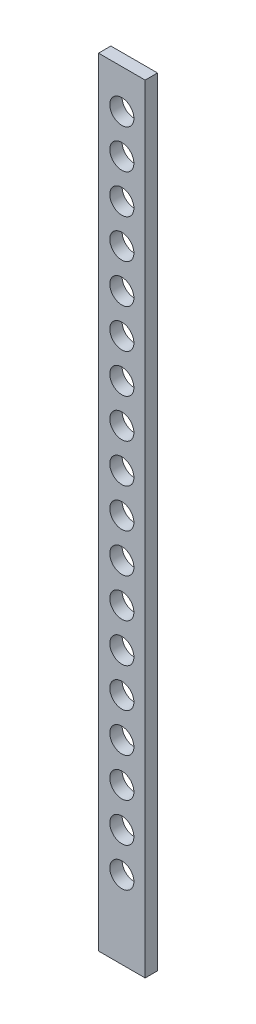
ISO-10303-21;
HEADER;
FILE_DESCRIPTION(('STEP AP214'),'2;1');
FILE_NAME('part.step','',(''),(''),'','','');
FILE_SCHEMA(('AUTOMOTIVE_DESIGN { 1 0 10303 214 1 1 1 1 }'));
ENDSEC;
DATA;
#1=APPLICATION_CONTEXT('core data for automotive mechanical design processes');
#2=APPLICATION_PROTOCOL_DEFINITION('international standard','automotive_design',2000,#1);
#3=PRODUCT_CONTEXT('',#1,'mechanical');
#4=PRODUCT('Part','Part','',(#3));
#5=PRODUCT_RELATED_PRODUCT_CATEGORY('part','',(#4));
#6=PRODUCT_DEFINITION_FORMATION('','',#4);
#7=PRODUCT_DEFINITION_CONTEXT('part definition',#1,'design');
#8=PRODUCT_DEFINITION('design','',#6,#7);
#9=PRODUCT_DEFINITION_SHAPE('','',#8);
#10=(LENGTH_UNIT() NAMED_UNIT(*) SI_UNIT(.MILLI.,.METRE.));
#11=(NAMED_UNIT(*) PLANE_ANGLE_UNIT() SI_UNIT($,.RADIAN.));
#12=(NAMED_UNIT(*) SI_UNIT($,.STERADIAN.) SOLID_ANGLE_UNIT());
#13=UNCERTAINTY_MEASURE_WITH_UNIT(LENGTH_MEASURE(1.E-05),#10,'distance_accuracy_value','');
#14=(GEOMETRIC_REPRESENTATION_CONTEXT(3) GLOBAL_UNCERTAINTY_ASSIGNED_CONTEXT((#13)) GLOBAL_UNIT_ASSIGNED_CONTEXT((#10,
#11,#12)) REPRESENTATION_CONTEXT('',''));
#15=CARTESIAN_POINT('',(0.,0.,0.));
#16=DIRECTION('',(0.,0.,1.));
#17=DIRECTION('',(1.,0.,0.));
#18=AXIS2_PLACEMENT_3D('',#15,#16,#17);
#19=CARTESIAN_POINT('',(0.,-40.,-0.000999999999999916));
#20=DIRECTION('',(0.,0.,1.));
#21=DIRECTION('',(1.,0.,0.));
#22=AXIS2_PLACEMENT_3D('',#19,#20,#21);
#23=CYLINDRICAL_SURFACE('',#22,1.55);
#24=CARTESIAN_POINT('',(0.,-40.,0.));
#25=DIRECTION('',(0.,0.,-1.));
#26=DIRECTION('',(-1.,0.,0.));
#27=AXIS2_PLACEMENT_3D('',#24,#25,#26);
#28=CIRCLE('',#27,1.55);
#29=CARTESIAN_POINT('',(-1.55,-40.,0.));
#30=VERTEX_POINT('',#29);
#31=EDGE_CURVE('E41',#30,#30,#28,.F.);
#32=ORIENTED_EDGE('',*,*,#31,.F.);
#33=EDGE_LOOP('',(#32));
#34=FACE_BOUND('',#33,.T.);
#35=CARTESIAN_POINT('',(0.,-40.,1.5875));
#36=DIRECTION('',(0.,0.,1.));
#37=DIRECTION('',(1.,0.,0.));
#38=AXIS2_PLACEMENT_3D('',#35,#36,#37);
#39=CIRCLE('',#38,1.55);
#40=CARTESIAN_POINT('',(1.55,-40.,1.5875));
#41=VERTEX_POINT('',#40);
#42=EDGE_CURVE('E11',#41,#41,#39,.T.);
#43=ORIENTED_EDGE('',*,*,#42,.T.);
#44=EDGE_LOOP('',(#43));
#45=FACE_BOUND('',#44,.T.);
#46=ADVANCED_FACE('F33',(#34,#45),#23,.F.);
#47=CARTESIAN_POINT('',(0.,-35.,-0.000999999999999916));
#48=DIRECTION('',(0.,0.,1.));
#49=DIRECTION('',(1.,0.,0.));
#50=AXIS2_PLACEMENT_3D('',#47,#48,#49);
#51=CYLINDRICAL_SURFACE('',#50,1.55);
#52=CARTESIAN_POINT('',(0.,-35.,0.));
#53=DIRECTION('',(0.,0.,-1.));
#54=DIRECTION('',(-1.,0.,0.));
#55=AXIS2_PLACEMENT_3D('',#52,#53,#54);
#56=CIRCLE('',#55,1.55);
#57=CARTESIAN_POINT('',(-1.55,-35.,0.));
#58=VERTEX_POINT('',#57);
#59=EDGE_CURVE('E141',#58,#58,#56,.F.);
#60=ORIENTED_EDGE('',*,*,#59,.F.);
#61=EDGE_LOOP('',(#60));
#62=FACE_BOUND('',#61,.T.);
#63=CARTESIAN_POINT('',(0.,-35.,1.5875));
#64=DIRECTION('',(0.,0.,1.));
#65=DIRECTION('',(1.,0.,0.));
#66=AXIS2_PLACEMENT_3D('',#63,#64,#65);
#67=CIRCLE('',#66,1.55);
#68=CARTESIAN_POINT('',(1.55,-35.,1.5875));
#69=VERTEX_POINT('',#68);
#70=EDGE_CURVE('E144',#69,#69,#67,.T.);
#71=ORIENTED_EDGE('',*,*,#70,.T.);
#72=EDGE_LOOP('',(#71));
#73=FACE_BOUND('',#72,.T.);
#74=ADVANCED_FACE('F153',(#62,#73),#51,.F.);
#75=CARTESIAN_POINT('',(0.,-30.,-0.000999999999999916));
#76=DIRECTION('',(0.,0.,1.));
#77=DIRECTION('',(1.,0.,0.));
#78=AXIS2_PLACEMENT_3D('',#75,#76,#77);
#79=CYLINDRICAL_SURFACE('',#78,1.55);
#80=CARTESIAN_POINT('',(0.,-30.,0.));
#81=DIRECTION('',(0.,0.,-1.));
#82=DIRECTION('',(-1.,0.,0.));
#83=AXIS2_PLACEMENT_3D('',#80,#81,#82);
#84=CIRCLE('',#83,1.55);
#85=CARTESIAN_POINT('',(-1.55,-30.,0.));
#86=VERTEX_POINT('',#85);
#87=EDGE_CURVE('E135',#86,#86,#84,.F.);
#88=ORIENTED_EDGE('',*,*,#87,.F.);
#89=EDGE_LOOP('',(#88));
#90=FACE_BOUND('',#89,.T.);
#91=CARTESIAN_POINT('',(0.,-30.,1.5875));
#92=DIRECTION('',(0.,0.,1.));
#93=DIRECTION('',(1.,0.,0.));
#94=AXIS2_PLACEMENT_3D('',#91,#92,#93);
#95=CIRCLE('',#94,1.55);
#96=CARTESIAN_POINT('',(1.55,-30.,1.5875));
#97=VERTEX_POINT('',#96);
#98=EDGE_CURVE('E138',#97,#97,#95,.T.);
#99=ORIENTED_EDGE('',*,*,#98,.T.);
#100=EDGE_LOOP('',(#99));
#101=FACE_BOUND('',#100,.T.);
#102=ADVANCED_FACE('F196',(#90,#101),#79,.F.);
#103=CARTESIAN_POINT('',(0.,-25.,-0.000999999999999916));
#104=DIRECTION('',(0.,0.,1.));
#105=DIRECTION('',(1.,0.,0.));
#106=AXIS2_PLACEMENT_3D('',#103,#104,#105);
#107=CYLINDRICAL_SURFACE('',#106,1.55);
#108=CARTESIAN_POINT('',(0.,-25.,0.));
#109=DIRECTION('',(0.,0.,-1.));
#110=DIRECTION('',(-1.,0.,0.));
#111=AXIS2_PLACEMENT_3D('',#108,#109,#110);
#112=CIRCLE('',#111,1.55);
#113=CARTESIAN_POINT('',(-1.55,-25.,0.));
#114=VERTEX_POINT('',#113);
#115=EDGE_CURVE('E129',#114,#114,#112,.F.);
#116=ORIENTED_EDGE('',*,*,#115,.F.);
#117=EDGE_LOOP('',(#116));
#118=FACE_BOUND('',#117,.T.);
#119=CARTESIAN_POINT('',(0.,-25.,1.5875));
#120=DIRECTION('',(0.,0.,1.));
#121=DIRECTION('',(1.,0.,0.));
#122=AXIS2_PLACEMENT_3D('',#119,#120,#121);
#123=CIRCLE('',#122,1.55);
#124=CARTESIAN_POINT('',(1.55,-25.,1.5875));
#125=VERTEX_POINT('',#124);
#126=EDGE_CURVE('E132',#125,#125,#123,.T.);
#127=ORIENTED_EDGE('',*,*,#126,.T.);
#128=EDGE_LOOP('',(#127));
#129=FACE_BOUND('',#128,.T.);
#130=ADVANCED_FACE('F192',(#118,#129),#107,.F.);
#131=CARTESIAN_POINT('',(0.,-20.,-0.000999999999999916));
#132=DIRECTION('',(0.,0.,1.));
#133=DIRECTION('',(1.,0.,0.));
#134=AXIS2_PLACEMENT_3D('',#131,#132,#133);
#135=CYLINDRICAL_SURFACE('',#134,1.55);
#136=CARTESIAN_POINT('',(0.,-20.,0.));
#137=DIRECTION('',(0.,0.,-1.));
#138=DIRECTION('',(-1.,0.,0.));
#139=AXIS2_PLACEMENT_3D('',#136,#137,#138);
#140=CIRCLE('',#139,1.55);
#141=CARTESIAN_POINT('',(-1.55,-20.,0.));
#142=VERTEX_POINT('',#141);
#143=EDGE_CURVE('E123',#142,#142,#140,.F.);
#144=ORIENTED_EDGE('',*,*,#143,.F.);
#145=EDGE_LOOP('',(#144));
#146=FACE_BOUND('',#145,.T.);
#147=CARTESIAN_POINT('',(0.,-20.,1.5875));
#148=DIRECTION('',(0.,0.,1.));
#149=DIRECTION('',(1.,0.,0.));
#150=AXIS2_PLACEMENT_3D('',#147,#148,#149);
#151=CIRCLE('',#150,1.55);
#152=CARTESIAN_POINT('',(1.55,-20.,1.5875));
#153=VERTEX_POINT('',#152);
#154=EDGE_CURVE('E126',#153,#153,#151,.T.);
#155=ORIENTED_EDGE('',*,*,#154,.T.);
#156=EDGE_LOOP('',(#155));
#157=FACE_BOUND('',#156,.T.);
#158=ADVANCED_FACE('F188',(#146,#157),#135,.F.);
#159=CARTESIAN_POINT('',(0.,-15.,-0.000999999999999916));
#160=DIRECTION('',(0.,0.,1.));
#161=DIRECTION('',(1.,0.,0.));
#162=AXIS2_PLACEMENT_3D('',#159,#160,#161);
#163=CYLINDRICAL_SURFACE('',#162,1.55);
#164=CARTESIAN_POINT('',(0.,-15.,0.));
#165=DIRECTION('',(0.,0.,-1.));
#166=DIRECTION('',(-1.,0.,0.));
#167=AXIS2_PLACEMENT_3D('',#164,#165,#166);
#168=CIRCLE('',#167,1.55);
#169=CARTESIAN_POINT('',(-1.55,-15.,0.));
#170=VERTEX_POINT('',#169);
#171=EDGE_CURVE('E117',#170,#170,#168,.F.);
#172=ORIENTED_EDGE('',*,*,#171,.F.);
#173=EDGE_LOOP('',(#172));
#174=FACE_BOUND('',#173,.T.);
#175=CARTESIAN_POINT('',(0.,-15.,1.5875));
#176=DIRECTION('',(0.,0.,1.));
#177=DIRECTION('',(1.,0.,0.));
#178=AXIS2_PLACEMENT_3D('',#175,#176,#177);
#179=CIRCLE('',#178,1.55);
#180=CARTESIAN_POINT('',(1.55,-15.,1.5875));
#181=VERTEX_POINT('',#180);
#182=EDGE_CURVE('E120',#181,#181,#179,.T.);
#183=ORIENTED_EDGE('',*,*,#182,.T.);
#184=EDGE_LOOP('',(#183));
#185=FACE_BOUND('',#184,.T.);
#186=ADVANCED_FACE('F184',(#174,#185),#163,.F.);
#187=CARTESIAN_POINT('',(0.,-10.,-0.000999999999999916));
#188=DIRECTION('',(0.,0.,1.));
#189=DIRECTION('',(1.,0.,0.));
#190=AXIS2_PLACEMENT_3D('',#187,#188,#189);
#191=CYLINDRICAL_SURFACE('',#190,1.55);
#192=CARTESIAN_POINT('',(0.,-10.,0.));
#193=DIRECTION('',(0.,0.,-1.));
#194=DIRECTION('',(-1.,0.,0.));
#195=AXIS2_PLACEMENT_3D('',#192,#193,#194);
#196=CIRCLE('',#195,1.55);
#197=CARTESIAN_POINT('',(-1.55,-10.,0.));
#198=VERTEX_POINT('',#197);
#199=EDGE_CURVE('E111',#198,#198,#196,.F.);
#200=ORIENTED_EDGE('',*,*,#199,.F.);
#201=EDGE_LOOP('',(#200));
#202=FACE_BOUND('',#201,.T.);
#203=CARTESIAN_POINT('',(0.,-10.,1.5875));
#204=DIRECTION('',(0.,0.,1.));
#205=DIRECTION('',(1.,0.,0.));
#206=AXIS2_PLACEMENT_3D('',#203,#204,#205);
#207=CIRCLE('',#206,1.55);
#208=CARTESIAN_POINT('',(1.55,-10.,1.5875));
#209=VERTEX_POINT('',#208);
#210=EDGE_CURVE('E114',#209,#209,#207,.T.);
#211=ORIENTED_EDGE('',*,*,#210,.T.);
#212=EDGE_LOOP('',(#211));
#213=FACE_BOUND('',#212,.T.);
#214=ADVANCED_FACE('F180',(#202,#213),#191,.F.);
#215=CARTESIAN_POINT('',(3.,-50.,1.5875));
#216=DIRECTION('',(-1.,0.,0.));
#217=DIRECTION('',(0.,0.,1.));
#218=AXIS2_PLACEMENT_3D('',#215,#216,#217);
#219=PLANE('',#218);
#220=DIRECTION('',(0.,1.,0.));
#221=VECTOR('',#220,1.);
#222=CARTESIAN_POINT('',(3.,-50.,0.));
#223=LINE('',#222,#221);
#224=CARTESIAN_POINT('',(3.,-50.,0.));
#225=VERTEX_POINT('',#224);
#226=CARTESIAN_POINT('',(3.,50.,0.));
#227=VERTEX_POINT('',#226);
#228=EDGE_CURVE('E101',#225,#227,#223,.T.);
#229=ORIENTED_EDGE('',*,*,#228,.T.);
#230=DIRECTION('',(0.,0.,-1.));
#231=VECTOR('',#230,1.);
#232=CARTESIAN_POINT('',(3.,50.,1.5875));
#233=LINE('',#232,#231);
#234=CARTESIAN_POINT('',(3.,50.,1.5875));
#235=VERTEX_POINT('',#234);
#236=EDGE_CURVE('E92',#235,#227,#233,.T.);
#237=ORIENTED_EDGE('',*,*,#236,.F.);
#238=DIRECTION('',(0.,1.,0.));
#239=VECTOR('',#238,1.);
#240=CARTESIAN_POINT('',(3.,-50.,1.5875));
#241=LINE('',#240,#239);
#242=CARTESIAN_POINT('',(3.,-50.,1.5875));
#243=VERTEX_POINT('',#242);
#244=EDGE_CURVE('E86',#243,#235,#241,.T.);
#245=ORIENTED_EDGE('',*,*,#244,.F.);
#246=DIRECTION('',(0.,0.,-1.));
#247=VECTOR('',#246,1.);
#248=CARTESIAN_POINT('',(3.,-50.,1.5875));
#249=LINE('',#248,#247);
#250=EDGE_CURVE('E97',#243,#225,#249,.T.);
#251=ORIENTED_EDGE('',*,*,#250,.T.);
#252=EDGE_LOOP('',(#229,#237,#245,#251));
#253=FACE_BOUND('',#252,.T.);
#254=ADVANCED_FACE('F177',(#253),#219,.F.);
#255=CARTESIAN_POINT('',(-3.,50.,1.5875));
#256=DIRECTION('',(0.,-1.,0.));
#257=DIRECTION('',(0.,0.,-1.));
#258=AXIS2_PLACEMENT_3D('',#255,#256,#257);
#259=PLANE('',#258);
#260=DIRECTION('',(-1.,0.,0.));
#261=VECTOR('',#260,1.);
#262=CARTESIAN_POINT('',(-3.,50.,0.));
#263=LINE('',#262,#261);
#264=CARTESIAN_POINT('',(-3.,50.,0.));
#265=VERTEX_POINT('',#264);
#266=EDGE_CURVE('E91',#227,#265,#263,.T.);
#267=ORIENTED_EDGE('',*,*,#266,.T.);
#268=DIRECTION('',(0.,0.,-1.));
#269=VECTOR('',#268,1.);
#270=CARTESIAN_POINT('',(-3.,50.,1.5875));
#271=LINE('',#270,#269);
#272=CARTESIAN_POINT('',(-3.,50.,1.5875));
#273=VERTEX_POINT('',#272);
#274=EDGE_CURVE('E89',#273,#265,#271,.T.);
#275=ORIENTED_EDGE('',*,*,#274,.F.);
#276=DIRECTION('',(-1.,0.,0.));
#277=VECTOR('',#276,1.);
#278=CARTESIAN_POINT('',(-3.,50.,1.5875));
#279=LINE('',#278,#277);
#280=EDGE_CURVE('E80',#235,#273,#279,.T.);
#281=ORIENTED_EDGE('',*,*,#280,.F.);
#282=ORIENTED_EDGE('',*,*,#236,.T.);
#283=EDGE_LOOP('',(#267,#275,#281,#282));
#284=FACE_BOUND('',#283,.T.);
#285=ADVANCED_FACE('F90',(#284),#259,.F.);
#286=CARTESIAN_POINT('',(-3.,-50.,1.5875));
#287=DIRECTION('',(1.,0.,0.));
#288=DIRECTION('',(0.,0.,-1.));
#289=AXIS2_PLACEMENT_3D('',#286,#287,#288);
#290=PLANE('',#289);
#291=DIRECTION('',(0.,-1.,0.));
#292=VECTOR('',#291,1.);
#293=CARTESIAN_POINT('',(-3.,-50.,0.));
#294=LINE('',#293,#292);
#295=CARTESIAN_POINT('',(-3.,-50.,0.));
#296=VERTEX_POINT('',#295);
#297=EDGE_CURVE('E66',#265,#296,#294,.T.);
#298=ORIENTED_EDGE('',*,*,#297,.T.);
#299=DIRECTION('',(0.,0.,-1.));
#300=VECTOR('',#299,1.);
#301=CARTESIAN_POINT('',(-3.,-50.,1.5875));
#302=LINE('',#301,#300);
#303=CARTESIAN_POINT('',(-3.,-50.,1.5875));
#304=VERTEX_POINT('',#303);
#305=EDGE_CURVE('E93',#304,#296,#302,.T.);
#306=ORIENTED_EDGE('',*,*,#305,.F.);
#307=DIRECTION('',(0.,-1.,0.));
#308=VECTOR('',#307,1.);
#309=CARTESIAN_POINT('',(-3.,-50.,1.5875));
#310=LINE('',#309,#308);
#311=EDGE_CURVE('E84',#273,#304,#310,.T.);
#312=ORIENTED_EDGE('',*,*,#311,.F.);
#313=ORIENTED_EDGE('',*,*,#274,.T.);
#314=EDGE_LOOP('',(#298,#306,#312,#313));
#315=FACE_BOUND('',#314,.T.);
#316=ADVANCED_FACE('F95',(#315),#290,.F.);
#317=CARTESIAN_POINT('',(-3.,-50.,1.5875));
#318=DIRECTION('',(0.,1.,0.));
#319=DIRECTION('',(0.,0.,1.));
#320=AXIS2_PLACEMENT_3D('',#317,#318,#319);
#321=PLANE('',#320);
#322=DIRECTION('',(1.,0.,0.));
#323=VECTOR('',#322,1.);
#324=CARTESIAN_POINT('',(-3.,-50.,0.));
#325=LINE('',#324,#323);
#326=EDGE_CURVE('E72',#296,#225,#325,.T.);
#327=ORIENTED_EDGE('',*,*,#326,.T.);
#328=ORIENTED_EDGE('',*,*,#250,.F.);
#329=DIRECTION('',(1.,0.,0.));
#330=VECTOR('',#329,1.);
#331=CARTESIAN_POINT('',(-3.,-50.,1.5875));
#332=LINE('',#331,#330);
#333=EDGE_CURVE('E49',#304,#243,#332,.T.);
#334=ORIENTED_EDGE('',*,*,#333,.F.);
#335=ORIENTED_EDGE('',*,*,#305,.T.);
#336=EDGE_LOOP('',(#327,#328,#334,#335));
#337=FACE_BOUND('',#336,.T.);
#338=ADVANCED_FACE('F157',(#337),#321,.F.);
#339=CARTESIAN_POINT('',(0.,0.,1.5875));
#340=DIRECTION('',(0.,0.,-1.));
#341=DIRECTION('',(-1.,0.,0.));
#342=AXIS2_PLACEMENT_3D('',#339,#340,#341);
#343=PLANE('',#342);
#344=CARTESIAN_POINT('',(0.,45.,1.5875));
#345=DIRECTION('',(0.,0.,1.));
#346=DIRECTION('',(1.,0.,0.));
#347=AXIS2_PLACEMENT_3D('',#344,#345,#346);
#348=CIRCLE('',#347,1.55);
#349=CARTESIAN_POINT('',(1.55,45.,1.5875));
#350=VERTEX_POINT('',#349);
#351=EDGE_CURVE('E382',#350,#350,#348,.T.);
#352=ORIENTED_EDGE('',*,*,#351,.F.);
#353=EDGE_LOOP('',(#352));
#354=FACE_BOUND('',#353,.T.);
#355=CARTESIAN_POINT('',(0.,40.,1.5875));
#356=DIRECTION('',(0.,0.,1.));
#357=DIRECTION('',(1.,0.,0.));
#358=AXIS2_PLACEMENT_3D('',#355,#356,#357);
#359=CIRCLE('',#358,1.55);
#360=CARTESIAN_POINT('',(1.55,40.,1.5875));
#361=VERTEX_POINT('',#360);
#362=EDGE_CURVE('E386',#361,#361,#359,.T.);
#363=ORIENTED_EDGE('',*,*,#362,.F.);
#364=EDGE_LOOP('',(#363));
#365=FACE_BOUND('',#364,.T.);
#366=CARTESIAN_POINT('',(0.,35.,1.5875));
#367=DIRECTION('',(0.,0.,1.));
#368=DIRECTION('',(1.,0.,0.));
#369=AXIS2_PLACEMENT_3D('',#366,#367,#368);
#370=CIRCLE('',#369,1.55);
#371=CARTESIAN_POINT('',(1.55,35.,1.5875));
#372=VERTEX_POINT('',#371);
#373=EDGE_CURVE('E393',#372,#372,#370,.T.);
#374=ORIENTED_EDGE('',*,*,#373,.F.);
#375=EDGE_LOOP('',(#374));
#376=FACE_BOUND('',#375,.T.);
#377=CARTESIAN_POINT('',(0.,30.,1.5875));
#378=DIRECTION('',(0.,0.,1.));
#379=DIRECTION('',(1.,0.,0.));
#380=AXIS2_PLACEMENT_3D('',#377,#378,#379);
#381=CIRCLE('',#380,1.55);
#382=CARTESIAN_POINT('',(1.55,30.,1.5875));
#383=VERTEX_POINT('',#382);
#384=EDGE_CURVE('E399',#383,#383,#381,.T.);
#385=ORIENTED_EDGE('',*,*,#384,.F.);
#386=EDGE_LOOP('',(#385));
#387=FACE_BOUND('',#386,.T.);
#388=CARTESIAN_POINT('',(0.,25.,1.5875));
#389=DIRECTION('',(0.,0.,1.));
#390=DIRECTION('',(1.,0.,0.));
#391=AXIS2_PLACEMENT_3D('',#388,#389,#390);
#392=CIRCLE('',#391,1.55);
#393=CARTESIAN_POINT('',(1.55,25.,1.5875));
#394=VERTEX_POINT('',#393);
#395=EDGE_CURVE('E405',#394,#394,#392,.T.);
#396=ORIENTED_EDGE('',*,*,#395,.F.);
#397=EDGE_LOOP('',(#396));
#398=FACE_BOUND('',#397,.T.);
#399=CARTESIAN_POINT('',(0.,20.,1.5875));
#400=DIRECTION('',(0.,0.,1.));
#401=DIRECTION('',(1.,0.,0.));
#402=AXIS2_PLACEMENT_3D('',#399,#400,#401);
#403=CIRCLE('',#402,1.55);
#404=CARTESIAN_POINT('',(1.55,20.,1.5875));
#405=VERTEX_POINT('',#404);
#406=EDGE_CURVE('E411',#405,#405,#403,.T.);
#407=ORIENTED_EDGE('',*,*,#406,.F.);
#408=EDGE_LOOP('',(#407));
#409=FACE_BOUND('',#408,.T.);
#410=CARTESIAN_POINT('',(0.,15.,1.5875));
#411=DIRECTION('',(0.,0.,1.));
#412=DIRECTION('',(1.,0.,0.));
#413=AXIS2_PLACEMENT_3D('',#410,#411,#412);
#414=CIRCLE('',#413,1.55);
#415=CARTESIAN_POINT('',(1.55,15.,1.5875));
#416=VERTEX_POINT('',#415);
#417=EDGE_CURVE('E417',#416,#416,#414,.T.);
#418=ORIENTED_EDGE('',*,*,#417,.F.);
#419=EDGE_LOOP('',(#418));
#420=FACE_BOUND('',#419,.T.);
#421=CARTESIAN_POINT('',(0.,10.,1.5875));
#422=DIRECTION('',(0.,0.,1.));
#423=DIRECTION('',(1.,0.,0.));
#424=AXIS2_PLACEMENT_3D('',#421,#422,#423);
#425=CIRCLE('',#424,1.55);
#426=CARTESIAN_POINT('',(1.55,10.,1.5875));
#427=VERTEX_POINT('',#426);
#428=EDGE_CURVE('E423',#427,#427,#425,.T.);
#429=ORIENTED_EDGE('',*,*,#428,.F.);
#430=EDGE_LOOP('',(#429));
#431=FACE_BOUND('',#430,.T.);
#432=CARTESIAN_POINT('',(0.,5.,1.5875));
#433=DIRECTION('',(0.,0.,1.));
#434=DIRECTION('',(1.,0.,0.));
#435=AXIS2_PLACEMENT_3D('',#432,#433,#434);
#436=CIRCLE('',#435,1.55);
#437=CARTESIAN_POINT('',(1.55,5.,1.5875));
#438=VERTEX_POINT('',#437);
#439=EDGE_CURVE('E429',#438,#438,#436,.T.);
#440=ORIENTED_EDGE('',*,*,#439,.F.);
#441=EDGE_LOOP('',(#440));
#442=FACE_BOUND('',#441,.T.);
#443=CARTESIAN_POINT('',(0.,-5.,1.5875));
#444=DIRECTION('',(0.,0.,1.));
#445=DIRECTION('',(1.,0.,0.));
#446=AXIS2_PLACEMENT_3D('',#443,#444,#445);
#447=CIRCLE('',#446,1.55);
#448=CARTESIAN_POINT('',(1.55,-5.,1.5875));
#449=VERTEX_POINT('',#448);
#450=EDGE_CURVE('E437',#449,#449,#447,.T.);
#451=ORIENTED_EDGE('',*,*,#450,.F.);
#452=EDGE_LOOP('',(#451));
#453=FACE_BOUND('',#452,.T.);
#454=CARTESIAN_POINT('',(0.,0.,1.5875));
#455=DIRECTION('',(0.,0.,1.));
#456=DIRECTION('',(1.,0.,0.));
#457=AXIS2_PLACEMENT_3D('',#454,#455,#456);
#458=CIRCLE('',#457,1.55);
#459=CARTESIAN_POINT('',(1.55,0.,1.5875));
#460=VERTEX_POINT('',#459);
#461=EDGE_CURVE('E104',#460,#460,#458,.T.);
#462=ORIENTED_EDGE('',*,*,#461,.F.);
#463=EDGE_LOOP('',(#462));
#464=FACE_BOUND('',#463,.T.);
#465=ORIENTED_EDGE('',*,*,#244,.T.);
#466=ORIENTED_EDGE('',*,*,#280,.T.);
#467=ORIENTED_EDGE('',*,*,#311,.T.);
#468=ORIENTED_EDGE('',*,*,#333,.T.);
#469=EDGE_LOOP('',(#465,#466,#467,#468));
#470=FACE_BOUND('',#469,.T.);
#471=ORIENTED_EDGE('',*,*,#210,.F.);
#472=EDGE_LOOP('',(#471));
#473=FACE_BOUND('',#472,.T.);
#474=ORIENTED_EDGE('',*,*,#182,.F.);
#475=EDGE_LOOP('',(#474));
#476=FACE_BOUND('',#475,.T.);
#477=ORIENTED_EDGE('',*,*,#154,.F.);
#478=EDGE_LOOP('',(#477));
#479=FACE_BOUND('',#478,.T.);
#480=ORIENTED_EDGE('',*,*,#126,.F.);
#481=EDGE_LOOP('',(#480));
#482=FACE_BOUND('',#481,.T.);
#483=ORIENTED_EDGE('',*,*,#98,.F.);
#484=EDGE_LOOP('',(#483));
#485=FACE_BOUND('',#484,.T.);
#486=ORIENTED_EDGE('',*,*,#70,.F.);
#487=EDGE_LOOP('',(#486));
#488=FACE_BOUND('',#487,.T.);
#489=ORIENTED_EDGE('',*,*,#42,.F.);
#490=EDGE_LOOP('',(#489));
#491=FACE_BOUND('',#490,.T.);
#492=ADVANCED_FACE('F81',(#354,#365,#376,#387,#398,#409,#420,#431,#442,#453,#464,#470,#473,#476,
#479,#482,#485,#488,#491),#343,.F.);
#493=CARTESIAN_POINT('',(0.,0.,0.));
#494=DIRECTION('',(0.,0.,-1.));
#495=DIRECTION('',(-1.,0.,0.));
#496=AXIS2_PLACEMENT_3D('',#493,#494,#495);
#497=PLANE('',#496);
#498=CARTESIAN_POINT('',(0.,45.,0.));
#499=DIRECTION('',(0.,0.,-1.));
#500=DIRECTION('',(-1.,0.,0.));
#501=AXIS2_PLACEMENT_3D('',#498,#499,#500);
#502=CIRCLE('',#501,1.55);
#503=CARTESIAN_POINT('',(-1.55,45.,0.));
#504=VERTEX_POINT('',#503);
#505=EDGE_CURVE('E380',#504,#504,#502,.F.);
#506=ORIENTED_EDGE('',*,*,#505,.T.);
#507=EDGE_LOOP('',(#506));
#508=FACE_BOUND('',#507,.T.);
#509=CARTESIAN_POINT('',(0.,40.,0.));
#510=DIRECTION('',(0.,0.,-1.));
#511=DIRECTION('',(-1.,0.,0.));
#512=AXIS2_PLACEMENT_3D('',#509,#510,#511);
#513=CIRCLE('',#512,1.55);
#514=CARTESIAN_POINT('',(-1.55,40.,0.));
#515=VERTEX_POINT('',#514);
#516=EDGE_CURVE('E383',#515,#515,#513,.F.);
#517=ORIENTED_EDGE('',*,*,#516,.T.);
#518=EDGE_LOOP('',(#517));
#519=FACE_BOUND('',#518,.T.);
#520=CARTESIAN_POINT('',(0.,35.,0.));
#521=DIRECTION('',(0.,0.,-1.));
#522=DIRECTION('',(-1.,0.,0.));
#523=AXIS2_PLACEMENT_3D('',#520,#521,#522);
#524=CIRCLE('',#523,1.55);
#525=CARTESIAN_POINT('',(-1.55,35.,0.));
#526=VERTEX_POINT('',#525);
#527=EDGE_CURVE('E391',#526,#526,#524,.F.);
#528=ORIENTED_EDGE('',*,*,#527,.T.);
#529=EDGE_LOOP('',(#528));
#530=FACE_BOUND('',#529,.T.);
#531=CARTESIAN_POINT('',(0.,30.,0.));
#532=DIRECTION('',(0.,0.,-1.));
#533=DIRECTION('',(-1.,0.,0.));
#534=AXIS2_PLACEMENT_3D('',#531,#532,#533);
#535=CIRCLE('',#534,1.55);
#536=CARTESIAN_POINT('',(-1.55,30.,0.));
#537=VERTEX_POINT('',#536);
#538=EDGE_CURVE('E396',#537,#537,#535,.F.);
#539=ORIENTED_EDGE('',*,*,#538,.T.);
#540=EDGE_LOOP('',(#539));
#541=FACE_BOUND('',#540,.T.);
#542=CARTESIAN_POINT('',(0.,25.,0.));
#543=DIRECTION('',(0.,0.,-1.));
#544=DIRECTION('',(-1.,0.,0.));
#545=AXIS2_PLACEMENT_3D('',#542,#543,#544);
#546=CIRCLE('',#545,1.55);
#547=CARTESIAN_POINT('',(-1.55,25.,0.));
#548=VERTEX_POINT('',#547);
#549=EDGE_CURVE('E402',#548,#548,#546,.F.);
#550=ORIENTED_EDGE('',*,*,#549,.T.);
#551=EDGE_LOOP('',(#550));
#552=FACE_BOUND('',#551,.T.);
#553=CARTESIAN_POINT('',(0.,20.,0.));
#554=DIRECTION('',(0.,0.,-1.));
#555=DIRECTION('',(-1.,0.,0.));
#556=AXIS2_PLACEMENT_3D('',#553,#554,#555);
#557=CIRCLE('',#556,1.55);
#558=CARTESIAN_POINT('',(-1.55,20.,0.));
#559=VERTEX_POINT('',#558);
#560=EDGE_CURVE('E408',#559,#559,#557,.F.);
#561=ORIENTED_EDGE('',*,*,#560,.T.);
#562=EDGE_LOOP('',(#561));
#563=FACE_BOUND('',#562,.T.);
#564=CARTESIAN_POINT('',(0.,15.,0.));
#565=DIRECTION('',(0.,0.,-1.));
#566=DIRECTION('',(-1.,0.,0.));
#567=AXIS2_PLACEMENT_3D('',#564,#565,#566);
#568=CIRCLE('',#567,1.55);
#569=CARTESIAN_POINT('',(-1.55,15.,0.));
#570=VERTEX_POINT('',#569);
#571=EDGE_CURVE('E414',#570,#570,#568,.F.);
#572=ORIENTED_EDGE('',*,*,#571,.T.);
#573=EDGE_LOOP('',(#572));
#574=FACE_BOUND('',#573,.T.);
#575=CARTESIAN_POINT('',(0.,10.,0.));
#576=DIRECTION('',(0.,0.,-1.));
#577=DIRECTION('',(-1.,0.,0.));
#578=AXIS2_PLACEMENT_3D('',#575,#576,#577);
#579=CIRCLE('',#578,1.55);
#580=CARTESIAN_POINT('',(-1.55,10.,0.));
#581=VERTEX_POINT('',#580);
#582=EDGE_CURVE('E420',#581,#581,#579,.F.);
#583=ORIENTED_EDGE('',*,*,#582,.T.);
#584=EDGE_LOOP('',(#583));
#585=FACE_BOUND('',#584,.T.);
#586=CARTESIAN_POINT('',(0.,5.,0.));
#587=DIRECTION('',(0.,0.,-1.));
#588=DIRECTION('',(-1.,0.,0.));
#589=AXIS2_PLACEMENT_3D('',#586,#587,#588);
#590=CIRCLE('',#589,1.55);
#591=CARTESIAN_POINT('',(-1.55,5.,0.));
#592=VERTEX_POINT('',#591);
#593=EDGE_CURVE('E426',#592,#592,#590,.F.);
#594=ORIENTED_EDGE('',*,*,#593,.T.);
#595=EDGE_LOOP('',(#594));
#596=FACE_BOUND('',#595,.T.);
#597=CARTESIAN_POINT('',(0.,-5.,0.));
#598=DIRECTION('',(0.,0.,-1.));
#599=DIRECTION('',(-1.,0.,0.));
#600=AXIS2_PLACEMENT_3D('',#597,#598,#599);
#601=CIRCLE('',#600,1.55);
#602=CARTESIAN_POINT('',(-1.55,-5.,0.));
#603=VERTEX_POINT('',#602);
#604=EDGE_CURVE('E432',#603,#603,#601,.F.);
#605=ORIENTED_EDGE('',*,*,#604,.T.);
#606=EDGE_LOOP('',(#605));
#607=FACE_BOUND('',#606,.T.);
#608=CARTESIAN_POINT('',(0.,0.,0.));
#609=DIRECTION('',(0.,0.,-1.));
#610=DIRECTION('',(-1.,0.,0.));
#611=AXIS2_PLACEMENT_3D('',#608,#609,#610);
#612=CIRCLE('',#611,1.55);
#613=CARTESIAN_POINT('',(-1.55,0.,0.));
#614=VERTEX_POINT('',#613);
#615=EDGE_CURVE('E440',#614,#614,#612,.F.);
#616=ORIENTED_EDGE('',*,*,#615,.T.);
#617=EDGE_LOOP('',(#616));
#618=FACE_BOUND('',#617,.T.);
#619=ORIENTED_EDGE('',*,*,#228,.F.);
#620=ORIENTED_EDGE('',*,*,#326,.F.);
#621=ORIENTED_EDGE('',*,*,#297,.F.);
#622=ORIENTED_EDGE('',*,*,#266,.F.);
#623=EDGE_LOOP('',(#619,#620,#621,#622));
#624=FACE_BOUND('',#623,.T.);
#625=ORIENTED_EDGE('',*,*,#199,.T.);
#626=EDGE_LOOP('',(#625));
#627=FACE_BOUND('',#626,.T.);
#628=ORIENTED_EDGE('',*,*,#171,.T.);
#629=EDGE_LOOP('',(#628));
#630=FACE_BOUND('',#629,.T.);
#631=ORIENTED_EDGE('',*,*,#143,.T.);
#632=EDGE_LOOP('',(#631));
#633=FACE_BOUND('',#632,.T.);
#634=ORIENTED_EDGE('',*,*,#115,.T.);
#635=EDGE_LOOP('',(#634));
#636=FACE_BOUND('',#635,.T.);
#637=ORIENTED_EDGE('',*,*,#87,.T.);
#638=EDGE_LOOP('',(#637));
#639=FACE_BOUND('',#638,.T.);
#640=ORIENTED_EDGE('',*,*,#59,.T.);
#641=EDGE_LOOP('',(#640));
#642=FACE_BOUND('',#641,.T.);
#643=ORIENTED_EDGE('',*,*,#31,.T.);
#644=EDGE_LOOP('',(#643));
#645=FACE_BOUND('',#644,.T.);
#646=ADVANCED_FACE('F149',(#508,#519,#530,#541,#552,#563,#574,#585,#596,#607,#618,#624,#627,
#630,#633,#636,#639,#642,#645),#497,.T.);
#647=CARTESIAN_POINT('',(0.,0.,-0.000999999999999916));
#648=DIRECTION('',(0.,0.,1.));
#649=DIRECTION('',(1.,0.,0.));
#650=AXIS2_PLACEMENT_3D('',#647,#648,#649);
#651=CYLINDRICAL_SURFACE('',#650,1.55);
#652=ORIENTED_EDGE('',*,*,#615,.F.);
#653=EDGE_LOOP('',(#652));
#654=FACE_BOUND('',#653,.T.);
#655=ORIENTED_EDGE('',*,*,#461,.T.);
#656=EDGE_LOOP('',(#655));
#657=FACE_BOUND('',#656,.T.);
#658=ADVANCED_FACE('F164',(#654,#657),#651,.F.);
#659=CARTESIAN_POINT('',(0.,-5.,-0.000999999999999916));
#660=DIRECTION('',(0.,0.,1.));
#661=DIRECTION('',(1.,0.,0.));
#662=AXIS2_PLACEMENT_3D('',#659,#660,#661);
#663=CYLINDRICAL_SURFACE('',#662,1.55);
#664=ORIENTED_EDGE('',*,*,#604,.F.);
#665=EDGE_LOOP('',(#664));
#666=FACE_BOUND('',#665,.T.);
#667=ORIENTED_EDGE('',*,*,#450,.T.);
#668=EDGE_LOOP('',(#667));
#669=FACE_BOUND('',#668,.T.);
#670=ADVANCED_FACE('F257',(#666,#669),#663,.F.);
#671=CARTESIAN_POINT('',(0.,5.,-0.000999999999999916));
#672=DIRECTION('',(0.,0.,1.));
#673=DIRECTION('',(1.,0.,0.));
#674=AXIS2_PLACEMENT_3D('',#671,#672,#673);
#675=CYLINDRICAL_SURFACE('',#674,1.55);
#676=ORIENTED_EDGE('',*,*,#593,.F.);
#677=EDGE_LOOP('',(#676));
#678=FACE_BOUND('',#677,.T.);
#679=ORIENTED_EDGE('',*,*,#439,.T.);
#680=EDGE_LOOP('',(#679));
#681=FACE_BOUND('',#680,.T.);
#682=ADVANCED_FACE('F284',(#678,#681),#675,.F.);
#683=CARTESIAN_POINT('',(0.,10.,-0.000999999999999916));
#684=DIRECTION('',(0.,0.,1.));
#685=DIRECTION('',(1.,0.,0.));
#686=AXIS2_PLACEMENT_3D('',#683,#684,#685);
#687=CYLINDRICAL_SURFACE('',#686,1.55);
#688=ORIENTED_EDGE('',*,*,#582,.F.);
#689=EDGE_LOOP('',(#688));
#690=FACE_BOUND('',#689,.T.);
#691=ORIENTED_EDGE('',*,*,#428,.T.);
#692=EDGE_LOOP('',(#691));
#693=FACE_BOUND('',#692,.T.);
#694=ADVANCED_FACE('F292',(#690,#693),#687,.F.);
#695=CARTESIAN_POINT('',(0.,15.,-0.000999999999999916));
#696=DIRECTION('',(0.,0.,1.));
#697=DIRECTION('',(1.,0.,0.));
#698=AXIS2_PLACEMENT_3D('',#695,#696,#697);
#699=CYLINDRICAL_SURFACE('',#698,1.55);
#700=ORIENTED_EDGE('',*,*,#571,.F.);
#701=EDGE_LOOP('',(#700));
#702=FACE_BOUND('',#701,.T.);
#703=ORIENTED_EDGE('',*,*,#417,.T.);
#704=EDGE_LOOP('',(#703));
#705=FACE_BOUND('',#704,.T.);
#706=ADVANCED_FACE('F302',(#702,#705),#699,.F.);
#707=CARTESIAN_POINT('',(0.,20.,-0.000999999999999916));
#708=DIRECTION('',(0.,0.,1.));
#709=DIRECTION('',(1.,0.,0.));
#710=AXIS2_PLACEMENT_3D('',#707,#708,#709);
#711=CYLINDRICAL_SURFACE('',#710,1.55);
#712=ORIENTED_EDGE('',*,*,#560,.F.);
#713=EDGE_LOOP('',(#712));
#714=FACE_BOUND('',#713,.T.);
#715=ORIENTED_EDGE('',*,*,#406,.T.);
#716=EDGE_LOOP('',(#715));
#717=FACE_BOUND('',#716,.T.);
#718=ADVANCED_FACE('F311',(#714,#717),#711,.F.);
#719=CARTESIAN_POINT('',(0.,25.,-0.000999999999999916));
#720=DIRECTION('',(0.,0.,1.));
#721=DIRECTION('',(1.,0.,0.));
#722=AXIS2_PLACEMENT_3D('',#719,#720,#721);
#723=CYLINDRICAL_SURFACE('',#722,1.55);
#724=ORIENTED_EDGE('',*,*,#549,.F.);
#725=EDGE_LOOP('',(#724));
#726=FACE_BOUND('',#725,.T.);
#727=ORIENTED_EDGE('',*,*,#395,.T.);
#728=EDGE_LOOP('',(#727));
#729=FACE_BOUND('',#728,.T.);
#730=ADVANCED_FACE('F320',(#726,#729),#723,.F.);
#731=CARTESIAN_POINT('',(0.,30.,-0.000999999999999916));
#732=DIRECTION('',(0.,0.,1.));
#733=DIRECTION('',(1.,0.,0.));
#734=AXIS2_PLACEMENT_3D('',#731,#732,#733);
#735=CYLINDRICAL_SURFACE('',#734,1.55);
#736=ORIENTED_EDGE('',*,*,#538,.F.);
#737=EDGE_LOOP('',(#736));
#738=FACE_BOUND('',#737,.T.);
#739=ORIENTED_EDGE('',*,*,#384,.T.);
#740=EDGE_LOOP('',(#739));
#741=FACE_BOUND('',#740,.T.);
#742=ADVANCED_FACE('F329',(#738,#741),#735,.F.);
#743=CARTESIAN_POINT('',(0.,35.,-0.000999999999999916));
#744=DIRECTION('',(0.,0.,1.));
#745=DIRECTION('',(1.,0.,0.));
#746=AXIS2_PLACEMENT_3D('',#743,#744,#745);
#747=CYLINDRICAL_SURFACE('',#746,1.55);
#748=ORIENTED_EDGE('',*,*,#527,.F.);
#749=EDGE_LOOP('',(#748));
#750=FACE_BOUND('',#749,.T.);
#751=ORIENTED_EDGE('',*,*,#373,.T.);
#752=EDGE_LOOP('',(#751));
#753=FACE_BOUND('',#752,.T.);
#754=ADVANCED_FACE('F338',(#750,#753),#747,.F.);
#755=CARTESIAN_POINT('',(0.,40.,-0.000999999999999916));
#756=DIRECTION('',(0.,0.,1.));
#757=DIRECTION('',(1.,0.,0.));
#758=AXIS2_PLACEMENT_3D('',#755,#756,#757);
#759=CYLINDRICAL_SURFACE('',#758,1.55);
#760=ORIENTED_EDGE('',*,*,#516,.F.);
#761=EDGE_LOOP('',(#760));
#762=FACE_BOUND('',#761,.T.);
#763=ORIENTED_EDGE('',*,*,#362,.T.);
#764=EDGE_LOOP('',(#763));
#765=FACE_BOUND('',#764,.T.);
#766=ADVANCED_FACE('F347',(#762,#765),#759,.F.);
#767=CARTESIAN_POINT('',(0.,45.,-0.000999999999999916));
#768=DIRECTION('',(0.,0.,1.));
#769=DIRECTION('',(1.,0.,0.));
#770=AXIS2_PLACEMENT_3D('',#767,#768,#769);
#771=CYLINDRICAL_SURFACE('',#770,1.55);
#772=ORIENTED_EDGE('',*,*,#505,.F.);
#773=EDGE_LOOP('',(#772));
#774=FACE_BOUND('',#773,.T.);
#775=ORIENTED_EDGE('',*,*,#351,.T.);
#776=EDGE_LOOP('',(#775));
#777=FACE_BOUND('',#776,.T.);
#778=ADVANCED_FACE('F356',(#774,#777),#771,.F.);
#779=CLOSED_SHELL('',(#46,#74,#102,#130,#158,#186,#214,#254,#285,#316,#338,#492,#646,#658,#670,
#682,#694,#706,#718,#730,#742,#754,#766,#778));
#780=MANIFOLD_SOLID_BREP('B2',#779);
#781=ADVANCED_BREP_SHAPE_REPRESENTATION('',(#18,#780),#14);
#782=SHAPE_DEFINITION_REPRESENTATION(#9,#781);
ENDSEC;
END-ISO-10303-21;
